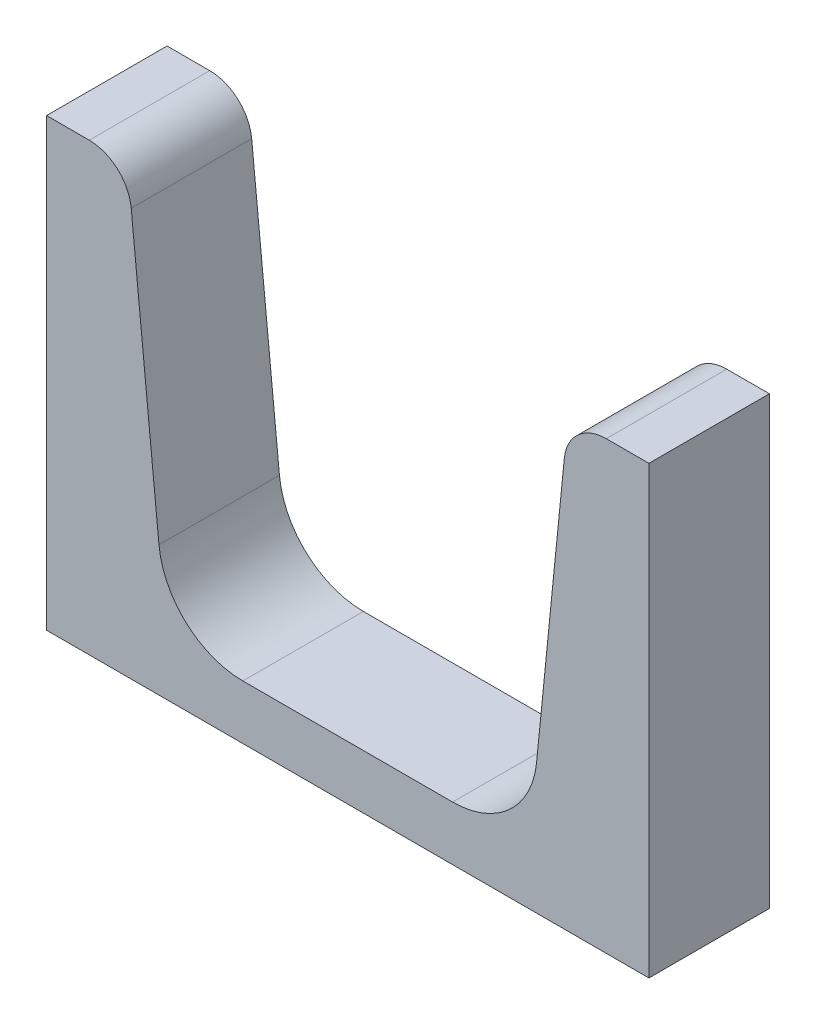
ISO-10303-21;
HEADER;
FILE_DESCRIPTION(('STEP AP214'),'2;1');
FILE_NAME('part.step','',(''),(''),'','','');
FILE_SCHEMA(('AUTOMOTIVE_DESIGN { 1 0 10303 214 1 1 1 1 }'));
ENDSEC;
DATA;
#1=APPLICATION_CONTEXT('core data for automotive mechanical design processes');
#2=APPLICATION_PROTOCOL_DEFINITION('international standard','automotive_design',2000,#1);
#3=PRODUCT_CONTEXT('',#1,'mechanical');
#4=PRODUCT('Part','Part','',(#3));
#5=PRODUCT_RELATED_PRODUCT_CATEGORY('part','',(#4));
#6=PRODUCT_DEFINITION_FORMATION('','',#4);
#7=PRODUCT_DEFINITION_CONTEXT('part definition',#1,'design');
#8=PRODUCT_DEFINITION('design','',#6,#7);
#9=PRODUCT_DEFINITION_SHAPE('','',#8);
#10=(LENGTH_UNIT() NAMED_UNIT(*) SI_UNIT(.MILLI.,.METRE.));
#11=(NAMED_UNIT(*) PLANE_ANGLE_UNIT() SI_UNIT($,.RADIAN.));
#12=(NAMED_UNIT(*) SI_UNIT($,.STERADIAN.) SOLID_ANGLE_UNIT());
#13=UNCERTAINTY_MEASURE_WITH_UNIT(LENGTH_MEASURE(1.E-05),#10,'distance_accuracy_value','');
#14=(GEOMETRIC_REPRESENTATION_CONTEXT(3) GLOBAL_UNCERTAINTY_ASSIGNED_CONTEXT((#13)) GLOBAL_UNIT_ASSIGNED_CONTEXT((#10,
#11,#12)) REPRESENTATION_CONTEXT('',''));
#15=CARTESIAN_POINT('',(0.,0.,0.));
#16=DIRECTION('',(0.,0.,1.));
#17=DIRECTION('',(1.,0.,0.));
#18=AXIS2_PLACEMENT_3D('',#15,#16,#17);
#19=CARTESIAN_POINT('',(15.0407556012557,4.5,10.));
#20=DIRECTION('',(0.,1.,0.));
#21=DIRECTION('',(0.,0.,1.));
#22=AXIS2_PLACEMENT_3D('',#19,#20,#21);
#23=PLANE('',#22);
#24=DIRECTION('',(1.,0.,0.));
#25=VECTOR('',#24,1.);
#26=CARTESIAN_POINT('',(15.0407556012557,4.5,0.));
#27=LINE('',#26,#25);
#28=CARTESIAN_POINT('',(-8.70584266647102,4.5,0.));
#29=VERTEX_POINT('',#28);
#30=CARTESIAN_POINT('',(8.70584266647103,4.5,0.));
#31=VERTEX_POINT('',#30);
#32=EDGE_CURVE('E163',#29,#31,#27,.T.);
#33=ORIENTED_EDGE('',*,*,#32,.F.);
#34=DIRECTION('',(0.,0.,-1.));
#35=VECTOR('',#34,1.);
#36=CARTESIAN_POINT('',(-8.70584266647103,4.5,10.));
#37=LINE('',#36,#35);
#38=CARTESIAN_POINT('',(-8.70584266647102,4.5,10.));
#39=VERTEX_POINT('',#38);
#40=EDGE_CURVE('E211',#29,#39,#37,.F.);
#41=ORIENTED_EDGE('',*,*,#40,.T.);
#42=DIRECTION('',(1.,0.,0.));
#43=VECTOR('',#42,1.);
#44=CARTESIAN_POINT('',(15.0407556012557,4.5,10.));
#45=LINE('',#44,#43);
#46=CARTESIAN_POINT('',(8.70584266647103,4.5,10.));
#47=VERTEX_POINT('',#46);
#48=EDGE_CURVE('E182',#39,#47,#45,.T.);
#49=ORIENTED_EDGE('',*,*,#48,.T.);
#50=DIRECTION('',(0.,0.,-1.));
#51=VECTOR('',#50,1.);
#52=CARTESIAN_POINT('',(8.70584266647103,4.5,0.));
#53=LINE('',#52,#51);
#54=EDGE_CURVE('E208',#47,#31,#53,.T.);
#55=ORIENTED_EDGE('',*,*,#54,.T.);
#56=EDGE_LOOP('',(#33,#41,#49,#55));
#57=FACE_BOUND('',#56,.T.);
#58=ADVANCED_FACE('F35',(#57),#23,.T.);
#59=CARTESIAN_POINT('',(-18.2907556012555,37.,10.));
#60=DIRECTION('',(0.99503719020999,0.0995037190209923,0.));
#61=DIRECTION('',(-0.0995037190209923,0.99503719020999,0.));
#62=AXIS2_PLACEMENT_3D('',#59,#60,#61);
#63=PLANE('',#62);
#64=DIRECTION('',(0.0995037190209923,-0.99503719020999,0.));
#65=VECTOR('',#64,1.);
#66=CARTESIAN_POINT('',(-18.2907556012555,37.,10.));
#67=LINE('',#66,#65);
#68=CARTESIAN_POINT('',(-17.9755819029128,33.8482630165735,10.));
#69=VERTEX_POINT('',#68);
#70=CARTESIAN_POINT('',(-15.671102997941,10.8034739668531,10.));
#71=VERTEX_POINT('',#70);
#72=EDGE_CURVE('E143',#69,#71,#67,.T.);
#73=ORIENTED_EDGE('',*,*,#72,.T.);
#74=DIRECTION('',(0.,0.,-1.));
#75=VECTOR('',#74,1.);
#76=CARTESIAN_POINT('',(-15.671102997941,10.803473966853,0.));
#77=LINE('',#76,#75);
#78=CARTESIAN_POINT('',(-15.671102997941,10.8034739668531,0.));
#79=VERTEX_POINT('',#78);
#80=EDGE_CURVE('E205',#71,#79,#77,.T.);
#81=ORIENTED_EDGE('',*,*,#80,.T.);
#82=DIRECTION('',(0.0995037190209923,-0.99503719020999,0.));
#83=VECTOR('',#82,1.);
#84=CARTESIAN_POINT('',(-18.2907556012555,37.,0.));
#85=LINE('',#84,#83);
#86=CARTESIAN_POINT('',(-17.9755819029128,33.8482630165735,0.));
#87=VERTEX_POINT('',#86);
#88=EDGE_CURVE('E179',#87,#79,#85,.T.);
#89=ORIENTED_EDGE('',*,*,#88,.F.);
#90=DIRECTION('',(0.,0.,-1.));
#91=VECTOR('',#90,1.);
#92=CARTESIAN_POINT('',(-17.9755819029128,33.8482630165735,10.));
#93=LINE('',#92,#91);
#94=EDGE_CURVE('E195',#87,#69,#93,.F.);
#95=ORIENTED_EDGE('',*,*,#94,.T.);
#96=EDGE_LOOP('',(#73,#81,#89,#95));
#97=FACE_BOUND('',#96,.T.);
#98=ADVANCED_FACE('F225',(#97),#63,.T.);
#99=CARTESIAN_POINT('',(-25.,37.,10.));
#100=DIRECTION('',(0.,1.,0.));
#101=DIRECTION('',(0.,0.,1.));
#102=AXIS2_PLACEMENT_3D('',#99,#100,#101);
#103=PLANE('',#102);
#104=DIRECTION('',(1.,0.,0.));
#105=VECTOR('',#104,1.);
#106=CARTESIAN_POINT('',(-25.,37.,10.));
#107=LINE('',#106,#105);
#108=CARTESIAN_POINT('',(-25.,37.,10.));
#109=VERTEX_POINT('',#108);
#110=CARTESIAN_POINT('',(-21.4582120686478,37.,10.));
#111=VERTEX_POINT('',#110);
#112=EDGE_CURVE('E158',#109,#111,#107,.T.);
#113=ORIENTED_EDGE('',*,*,#112,.T.);
#114=DIRECTION('',(0.,0.,-1.));
#115=VECTOR('',#114,1.);
#116=CARTESIAN_POINT('',(-21.4582120686478,37.,10.));
#117=LINE('',#116,#115);
#118=CARTESIAN_POINT('',(-21.4582120686478,37.,0.));
#119=VERTEX_POINT('',#118);
#120=EDGE_CURVE('E185',#111,#119,#117,.T.);
#121=ORIENTED_EDGE('',*,*,#120,.T.);
#122=DIRECTION('',(1.,0.,0.));
#123=VECTOR('',#122,1.);
#124=CARTESIAN_POINT('',(-25.,37.,0.));
#125=LINE('',#124,#123);
#126=CARTESIAN_POINT('',(-25.,37.,0.));
#127=VERTEX_POINT('',#126);
#128=EDGE_CURVE('E176',#127,#119,#125,.T.);
#129=ORIENTED_EDGE('',*,*,#128,.F.);
#130=DIRECTION('',(0.,0.,-1.));
#131=VECTOR('',#130,1.);
#132=CARTESIAN_POINT('',(-25.,37.,10.));
#133=LINE('',#132,#131);
#134=EDGE_CURVE('E183',#109,#127,#133,.T.);
#135=ORIENTED_EDGE('',*,*,#134,.F.);
#136=EDGE_LOOP('',(#113,#121,#129,#135));
#137=FACE_BOUND('',#136,.T.);
#138=ADVANCED_FACE('F250',(#137),#103,.T.);
#139=CARTESIAN_POINT('',(-25.,0.,10.));
#140=DIRECTION('',(-1.,0.,0.));
#141=DIRECTION('',(0.,0.,1.));
#142=AXIS2_PLACEMENT_3D('',#139,#140,#141);
#143=PLANE('',#142);
#144=DIRECTION('',(0.,1.,0.));
#145=VECTOR('',#144,1.);
#146=CARTESIAN_POINT('',(-25.,0.,0.));
#147=LINE('',#146,#145);
#148=CARTESIAN_POINT('',(-25.,0.,0.));
#149=VERTEX_POINT('',#148);
#150=EDGE_CURVE('E173',#149,#127,#147,.T.);
#151=ORIENTED_EDGE('',*,*,#150,.F.);
#152=DIRECTION('',(0.,0.,-1.));
#153=VECTOR('',#152,1.);
#154=CARTESIAN_POINT('',(-25.,0.,10.));
#155=LINE('',#154,#153);
#156=CARTESIAN_POINT('',(-25.,0.,10.));
#157=VERTEX_POINT('',#156);
#158=EDGE_CURVE('E186',#157,#149,#155,.T.);
#159=ORIENTED_EDGE('',*,*,#158,.F.);
#160=DIRECTION('',(0.,1.,0.));
#161=VECTOR('',#160,1.);
#162=CARTESIAN_POINT('',(-25.,0.,10.));
#163=LINE('',#162,#161);
#164=EDGE_CURVE('E152',#157,#109,#163,.T.);
#165=ORIENTED_EDGE('',*,*,#164,.T.);
#166=ORIENTED_EDGE('',*,*,#134,.T.);
#167=EDGE_LOOP('',(#151,#159,#165,#166));
#168=FACE_BOUND('',#167,.T.);
#169=ADVANCED_FACE('F246',(#168),#143,.T.);
#170=CARTESIAN_POINT('',(-25.,0.,10.));
#171=DIRECTION('',(0.,-1.,0.));
#172=DIRECTION('',(0.,0.,-1.));
#173=AXIS2_PLACEMENT_3D('',#170,#171,#172);
#174=PLANE('',#173);
#175=DIRECTION('',(-1.,0.,0.));
#176=VECTOR('',#175,1.);
#177=CARTESIAN_POINT('',(-25.,0.,0.));
#178=LINE('',#177,#176);
#179=CARTESIAN_POINT('',(25.,0.,0.));
#180=VERTEX_POINT('',#179);
#181=EDGE_CURVE('E170',#180,#149,#178,.T.);
#182=ORIENTED_EDGE('',*,*,#181,.F.);
#183=DIRECTION('',(0.,0.,-1.));
#184=VECTOR('',#183,1.);
#185=CARTESIAN_POINT('',(25.,0.,10.));
#186=LINE('',#185,#184);
#187=CARTESIAN_POINT('',(25.,0.,10.));
#188=VERTEX_POINT('',#187);
#189=EDGE_CURVE('E142',#188,#180,#186,.T.);
#190=ORIENTED_EDGE('',*,*,#189,.F.);
#191=DIRECTION('',(-1.,0.,0.));
#192=VECTOR('',#191,1.);
#193=CARTESIAN_POINT('',(-25.,0.,10.));
#194=LINE('',#193,#192);
#195=EDGE_CURVE('E150',#188,#157,#194,.T.);
#196=ORIENTED_EDGE('',*,*,#195,.T.);
#197=ORIENTED_EDGE('',*,*,#158,.T.);
#198=EDGE_LOOP('',(#182,#190,#196,#197));
#199=FACE_BOUND('',#198,.T.);
#200=ADVANCED_FACE('F244',(#199),#174,.T.);
#201=CARTESIAN_POINT('',(25.,0.,10.));
#202=DIRECTION('',(1.,0.,0.));
#203=DIRECTION('',(0.,0.,-1.));
#204=AXIS2_PLACEMENT_3D('',#201,#202,#203);
#205=PLANE('',#204);
#206=DIRECTION('',(0.,-1.,0.));
#207=VECTOR('',#206,1.);
#208=CARTESIAN_POINT('',(25.,0.,0.));
#209=LINE('',#208,#207);
#210=CARTESIAN_POINT('',(25.,37.,0.));
#211=VERTEX_POINT('',#210);
#212=EDGE_CURVE('E141',#211,#180,#209,.T.);
#213=ORIENTED_EDGE('',*,*,#212,.F.);
#214=DIRECTION('',(0.,0.,-1.));
#215=VECTOR('',#214,1.);
#216=CARTESIAN_POINT('',(25.,37.,10.));
#217=LINE('',#216,#215);
#218=CARTESIAN_POINT('',(25.,37.,10.));
#219=VERTEX_POINT('',#218);
#220=EDGE_CURVE('E126',#219,#211,#217,.T.);
#221=ORIENTED_EDGE('',*,*,#220,.F.);
#222=DIRECTION('',(0.,-1.,0.));
#223=VECTOR('',#222,1.);
#224=CARTESIAN_POINT('',(25.,0.,10.));
#225=LINE('',#224,#223);
#226=EDGE_CURVE('E134',#219,#188,#225,.T.);
#227=ORIENTED_EDGE('',*,*,#226,.T.);
#228=ORIENTED_EDGE('',*,*,#189,.T.);
#229=EDGE_LOOP('',(#213,#221,#227,#228));
#230=FACE_BOUND('',#229,.T.);
#231=ADVANCED_FACE('F139',(#230),#205,.T.);
#232=CARTESIAN_POINT('',(25.,37.,10.));
#233=DIRECTION('',(0.,1.,0.));
#234=DIRECTION('',(0.,0.,1.));
#235=AXIS2_PLACEMENT_3D('',#232,#233,#234);
#236=PLANE('',#235);
#237=DIRECTION('',(1.,0.,0.));
#238=VECTOR('',#237,1.);
#239=CARTESIAN_POINT('',(25.,37.,0.));
#240=LINE('',#239,#238);
#241=CARTESIAN_POINT('',(21.4582120686478,37.,0.));
#242=VERTEX_POINT('',#241);
#243=EDGE_CURVE('E167',#242,#211,#240,.T.);
#244=ORIENTED_EDGE('',*,*,#243,.F.);
#245=DIRECTION('',(0.,0.,-1.));
#246=VECTOR('',#245,1.);
#247=CARTESIAN_POINT('',(21.4582120686478,37.,10.));
#248=LINE('',#247,#246);
#249=CARTESIAN_POINT('',(21.4582120686478,37.,10.));
#250=VERTEX_POINT('',#249);
#251=EDGE_CURVE('E129',#242,#250,#248,.F.);
#252=ORIENTED_EDGE('',*,*,#251,.T.);
#253=DIRECTION('',(1.,0.,0.));
#254=VECTOR('',#253,1.);
#255=CARTESIAN_POINT('',(25.,37.,10.));
#256=LINE('',#255,#254);
#257=EDGE_CURVE('E122',#250,#219,#256,.T.);
#258=ORIENTED_EDGE('',*,*,#257,.T.);
#259=ORIENTED_EDGE('',*,*,#220,.T.);
#260=EDGE_LOOP('',(#244,#252,#258,#259));
#261=FACE_BOUND('',#260,.T.);
#262=ADVANCED_FACE('F125',(#261),#236,.T.);
#263=CARTESIAN_POINT('',(18.2907556012555,37.,10.));
#264=DIRECTION('',(-0.99503719020999,0.0995037190209923,0.));
#265=DIRECTION('',(-0.0995037190209923,-0.99503719020999,0.));
#266=AXIS2_PLACEMENT_3D('',#263,#264,#265);
#267=PLANE('',#266);
#268=DIRECTION('',(0.0995037190209923,0.99503719020999,0.));
#269=VECTOR('',#268,1.);
#270=CARTESIAN_POINT('',(18.2907556012555,37.,0.));
#271=LINE('',#270,#269);
#272=CARTESIAN_POINT('',(15.671102997941,10.8034739668531,0.));
#273=VERTEX_POINT('',#272);
#274=CARTESIAN_POINT('',(17.9755819029128,33.8482630165735,0.));
#275=VERTEX_POINT('',#274);
#276=EDGE_CURVE('E165',#273,#275,#271,.T.);
#277=ORIENTED_EDGE('',*,*,#276,.F.);
#278=DIRECTION('',(0.,0.,-1.));
#279=VECTOR('',#278,1.);
#280=CARTESIAN_POINT('',(15.671102997941,10.8034739668531,10.));
#281=LINE('',#280,#279);
#282=CARTESIAN_POINT('',(15.671102997941,10.8034739668531,10.));
#283=VERTEX_POINT('',#282);
#284=EDGE_CURVE('E56',#273,#283,#281,.F.);
#285=ORIENTED_EDGE('',*,*,#284,.T.);
#286=DIRECTION('',(0.0995037190209923,0.99503719020999,0.));
#287=VECTOR('',#286,1.);
#288=CARTESIAN_POINT('',(18.2907556012555,37.,10.));
#289=LINE('',#288,#287);
#290=CARTESIAN_POINT('',(17.9755819029128,33.8482630165735,10.));
#291=VERTEX_POINT('',#290);
#292=EDGE_CURVE('E135',#283,#291,#289,.T.);
#293=ORIENTED_EDGE('',*,*,#292,.T.);
#294=DIRECTION('',(0.,0.,-1.));
#295=VECTOR('',#294,1.);
#296=CARTESIAN_POINT('',(17.9755819029128,33.8482630165735,10.));
#297=LINE('',#296,#295);
#298=EDGE_CURVE('E201',#291,#275,#297,.T.);
#299=ORIENTED_EDGE('',*,*,#298,.T.);
#300=EDGE_LOOP('',(#277,#285,#293,#299));
#301=FACE_BOUND('',#300,.T.);
#302=ADVANCED_FACE('F237',(#301),#267,.T.);
#303=CARTESIAN_POINT('',(-25.,4.5,10.));
#304=DIRECTION('',(0.,0.,-1.));
#305=DIRECTION('',(-1.,0.,0.));
#306=AXIS2_PLACEMENT_3D('',#303,#304,#305);
#307=PLANE('',#306);
#308=ORIENTED_EDGE('',*,*,#72,.F.);
#309=CARTESIAN_POINT('',(-21.4582120686478,33.5,10.));
#310=DIRECTION('',(0.,0.,-1.));
#311=DIRECTION('',(-1.,0.,0.));
#312=AXIS2_PLACEMENT_3D('',#309,#310,#311);
#313=CIRCLE('',#312,3.5);
#314=EDGE_CURVE('E199',#69,#111,#313,.F.);
#315=ORIENTED_EDGE('',*,*,#314,.T.);
#316=ORIENTED_EDGE('',*,*,#112,.F.);
#317=ORIENTED_EDGE('',*,*,#164,.F.);
#318=ORIENTED_EDGE('',*,*,#195,.F.);
#319=ORIENTED_EDGE('',*,*,#226,.F.);
#320=ORIENTED_EDGE('',*,*,#257,.F.);
#321=CARTESIAN_POINT('',(21.4582120686478,33.5,10.));
#322=DIRECTION('',(0.,0.,-1.));
#323=DIRECTION('',(-1.,0.,0.));
#324=AXIS2_PLACEMENT_3D('',#321,#322,#323);
#325=CIRCLE('',#324,3.5);
#326=EDGE_CURVE('E197',#250,#291,#325,.F.);
#327=ORIENTED_EDGE('',*,*,#326,.T.);
#328=ORIENTED_EDGE('',*,*,#292,.F.);
#329=CARTESIAN_POINT('',(8.70584266647103,11.5,10.));
#330=DIRECTION('',(0.,0.,-1.));
#331=DIRECTION('',(-1.,0.,0.));
#332=AXIS2_PLACEMENT_3D('',#329,#330,#331);
#333=CIRCLE('',#332,7.);
#334=EDGE_CURVE('E11',#283,#47,#333,.T.);
#335=ORIENTED_EDGE('',*,*,#334,.T.);
#336=ORIENTED_EDGE('',*,*,#48,.F.);
#337=CARTESIAN_POINT('',(-8.70584266647103,11.5,10.));
#338=DIRECTION('',(0.,0.,-1.));
#339=DIRECTION('',(-1.,0.,0.));
#340=AXIS2_PLACEMENT_3D('',#337,#338,#339);
#341=CIRCLE('',#340,7.);
#342=EDGE_CURVE('E216',#39,#71,#341,.T.);
#343=ORIENTED_EDGE('',*,*,#342,.T.);
#344=EDGE_LOOP('',(#308,#315,#316,#317,#318,#319,#320,#327,#328,#335,#336,#343));
#345=FACE_BOUND('',#344,.T.);
#346=ADVANCED_FACE('F147',(#345),#307,.F.);
#347=CARTESIAN_POINT('',(-25.,4.5,0.));
#348=DIRECTION('',(0.,0.,-1.));
#349=DIRECTION('',(-1.,0.,0.));
#350=AXIS2_PLACEMENT_3D('',#347,#348,#349);
#351=PLANE('',#350);
#352=ORIENTED_EDGE('',*,*,#128,.T.);
#353=CARTESIAN_POINT('',(-21.4582120686478,33.5,0.));
#354=DIRECTION('',(0.,0.,-1.));
#355=DIRECTION('',(-1.,0.,0.));
#356=AXIS2_PLACEMENT_3D('',#353,#354,#355);
#357=CIRCLE('',#356,3.5);
#358=EDGE_CURVE('E193',#119,#87,#357,.T.);
#359=ORIENTED_EDGE('',*,*,#358,.T.);
#360=ORIENTED_EDGE('',*,*,#88,.T.);
#361=CARTESIAN_POINT('',(-8.70584266647103,11.5,0.));
#362=DIRECTION('',(0.,0.,-1.));
#363=DIRECTION('',(-1.,0.,0.));
#364=AXIS2_PLACEMENT_3D('',#361,#362,#363);
#365=CIRCLE('',#364,7.);
#366=EDGE_CURVE('E214',#79,#29,#365,.F.);
#367=ORIENTED_EDGE('',*,*,#366,.T.);
#368=ORIENTED_EDGE('',*,*,#32,.T.);
#369=CARTESIAN_POINT('',(8.70584266647103,11.5,0.));
#370=DIRECTION('',(0.,0.,-1.));
#371=DIRECTION('',(-1.,0.,0.));
#372=AXIS2_PLACEMENT_3D('',#369,#370,#371);
#373=CIRCLE('',#372,7.);
#374=EDGE_CURVE('E43',#31,#273,#373,.F.);
#375=ORIENTED_EDGE('',*,*,#374,.T.);
#376=ORIENTED_EDGE('',*,*,#276,.T.);
#377=CARTESIAN_POINT('',(21.4582120686478,33.5,0.));
#378=DIRECTION('',(0.,0.,-1.));
#379=DIRECTION('',(-1.,0.,0.));
#380=AXIS2_PLACEMENT_3D('',#377,#378,#379);
#381=CIRCLE('',#380,3.5);
#382=EDGE_CURVE('E191',#275,#242,#381,.T.);
#383=ORIENTED_EDGE('',*,*,#382,.T.);
#384=ORIENTED_EDGE('',*,*,#243,.T.);
#385=ORIENTED_EDGE('',*,*,#212,.T.);
#386=ORIENTED_EDGE('',*,*,#181,.T.);
#387=ORIENTED_EDGE('',*,*,#150,.T.);
#388=EDGE_LOOP('',(#352,#359,#360,#367,#368,#375,#376,#383,#384,#385,#386,#387));
#389=FACE_BOUND('',#388,.T.);
#390=ADVANCED_FACE('F230',(#389),#351,.T.);
#391=CARTESIAN_POINT('',(-21.4582120686478,33.5,10.));
#392=DIRECTION('',(0.,0.,-1.));
#393=DIRECTION('',(-1.,0.,0.));
#394=AXIS2_PLACEMENT_3D('',#391,#392,#393);
#395=CYLINDRICAL_SURFACE('',#394,3.5);
#396=ORIENTED_EDGE('',*,*,#314,.F.);
#397=ORIENTED_EDGE('',*,*,#94,.F.);
#398=ORIENTED_EDGE('',*,*,#358,.F.);
#399=ORIENTED_EDGE('',*,*,#120,.F.);
#400=EDGE_LOOP('',(#396,#397,#398,#399));
#401=FACE_BOUND('',#400,.T.);
#402=ADVANCED_FACE('F253',(#401),#395,.T.);
#403=CARTESIAN_POINT('',(21.4582120686478,33.5,10.));
#404=DIRECTION('',(0.,0.,-1.));
#405=DIRECTION('',(-1.,0.,0.));
#406=AXIS2_PLACEMENT_3D('',#403,#404,#405);
#407=CYLINDRICAL_SURFACE('',#406,3.5);
#408=ORIENTED_EDGE('',*,*,#326,.F.);
#409=ORIENTED_EDGE('',*,*,#251,.F.);
#410=ORIENTED_EDGE('',*,*,#382,.F.);
#411=ORIENTED_EDGE('',*,*,#298,.F.);
#412=EDGE_LOOP('',(#408,#409,#410,#411));
#413=FACE_BOUND('',#412,.T.);
#414=ADVANCED_FACE('F240',(#413),#407,.T.);
#415=CARTESIAN_POINT('',(-8.70584266647103,11.5,10.));
#416=DIRECTION('',(0.,0.,1.));
#417=DIRECTION('',(1.,0.,0.));
#418=AXIS2_PLACEMENT_3D('',#415,#416,#417);
#419=CYLINDRICAL_SURFACE('',#418,7.);
#420=ORIENTED_EDGE('',*,*,#342,.F.);
#421=ORIENTED_EDGE('',*,*,#40,.F.);
#422=ORIENTED_EDGE('',*,*,#366,.F.);
#423=ORIENTED_EDGE('',*,*,#80,.F.);
#424=EDGE_LOOP('',(#420,#421,#422,#423));
#425=FACE_BOUND('',#424,.T.);
#426=ADVANCED_FACE('F228',(#425),#419,.F.);
#427=CARTESIAN_POINT('',(8.70584266647103,11.5,10.));
#428=DIRECTION('',(0.,0.,1.));
#429=DIRECTION('',(1.,0.,0.));
#430=AXIS2_PLACEMENT_3D('',#427,#428,#429);
#431=CYLINDRICAL_SURFACE('',#430,7.);
#432=ORIENTED_EDGE('',*,*,#334,.F.);
#433=ORIENTED_EDGE('',*,*,#284,.F.);
#434=ORIENTED_EDGE('',*,*,#374,.F.);
#435=ORIENTED_EDGE('',*,*,#54,.F.);
#436=EDGE_LOOP('',(#432,#433,#434,#435));
#437=FACE_BOUND('',#436,.T.);
#438=ADVANCED_FACE('F37',(#437),#431,.F.);
#439=CLOSED_SHELL('',(#58,#98,#138,#169,#200,#231,#262,#302,#346,#390,#402,#414,#426,#438));
#440=MANIFOLD_SOLID_BREP('B2',#439);
#441=ADVANCED_BREP_SHAPE_REPRESENTATION('',(#18,#440),#14);
#442=SHAPE_DEFINITION_REPRESENTATION(#9,#441);
ENDSEC;
END-ISO-10303-21;
